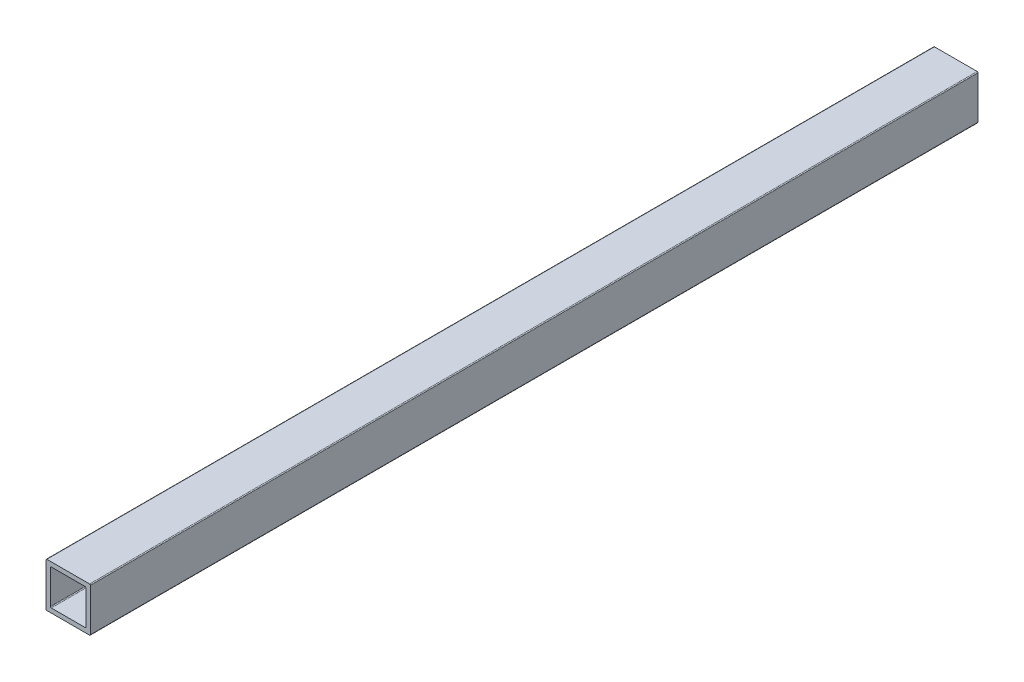
ISO-10303-21;
HEADER;
FILE_DESCRIPTION(('STEP AP214'),'2;1');
FILE_NAME('part.step','',(''),(''),'','','');
FILE_SCHEMA(('AUTOMOTIVE_DESIGN { 1 0 10303 214 1 1 1 1 }'));
ENDSEC;
DATA;
#1=APPLICATION_CONTEXT('core data for automotive mechanical design processes');
#2=APPLICATION_PROTOCOL_DEFINITION('international standard','automotive_design',2000,#1);
#3=PRODUCT_CONTEXT('',#1,'mechanical');
#4=PRODUCT('Part','Part','',(#3));
#5=PRODUCT_RELATED_PRODUCT_CATEGORY('part','',(#4));
#6=PRODUCT_DEFINITION_FORMATION('','',#4);
#7=PRODUCT_DEFINITION_CONTEXT('part definition',#1,'design');
#8=PRODUCT_DEFINITION('design','',#6,#7);
#9=PRODUCT_DEFINITION_SHAPE('','',#8);
#10=(LENGTH_UNIT() NAMED_UNIT(*) SI_UNIT(.MILLI.,.METRE.));
#11=(NAMED_UNIT(*) PLANE_ANGLE_UNIT() SI_UNIT($,.RADIAN.));
#12=(NAMED_UNIT(*) SI_UNIT($,.STERADIAN.) SOLID_ANGLE_UNIT());
#13=UNCERTAINTY_MEASURE_WITH_UNIT(LENGTH_MEASURE(1.E-05),#10,'distance_accuracy_value','');
#14=(GEOMETRIC_REPRESENTATION_CONTEXT(3) GLOBAL_UNCERTAINTY_ASSIGNED_CONTEXT((#13)) GLOBAL_UNIT_ASSIGNED_CONTEXT((#10,
#11,#12)) REPRESENTATION_CONTEXT('',''));
#15=CARTESIAN_POINT('',(0.,0.,0.));
#16=DIRECTION('',(0.,0.,1.));
#17=DIRECTION('',(1.,0.,0.));
#18=AXIS2_PLACEMENT_3D('',#15,#16,#17);
#19=CARTESIAN_POINT('',(0.,0.,200.));
#20=DIRECTION('',(0.,0.,1.));
#21=DIRECTION('',(1.,0.,0.));
#22=AXIS2_PLACEMENT_3D('',#19,#20,#21);
#23=PLANE('',#22);
#24=DIRECTION('',(0.,-1.,0.));
#25=VECTOR('',#24,1.);
#26=CARTESIAN_POINT('',(-5.,5.,200.));
#27=LINE('',#26,#25);
#28=CARTESIAN_POINT('',(-5.,4.8,200.));
#29=VERTEX_POINT('',#28);
#30=CARTESIAN_POINT('',(-5.,-4.8,200.));
#31=VERTEX_POINT('',#30);
#32=EDGE_CURVE('E265',#29,#31,#27,.T.);
#33=ORIENTED_EDGE('',*,*,#32,.T.);
#34=CARTESIAN_POINT('',(-4.8,-4.8,200.));
#35=DIRECTION('',(0.,0.,1.));
#36=DIRECTION('',(1.,0.,0.));
#37=AXIS2_PLACEMENT_3D('',#34,#35,#36);
#38=CIRCLE('',#37,0.2);
#39=CARTESIAN_POINT('',(-4.8,-5.,200.));
#40=VERTEX_POINT('',#39);
#41=EDGE_CURVE('E215',#31,#40,#38,.T.);
#42=ORIENTED_EDGE('',*,*,#41,.T.);
#43=DIRECTION('',(1.,0.,0.));
#44=VECTOR('',#43,1.);
#45=CARTESIAN_POINT('',(-5.,-5.,200.));
#46=LINE('',#45,#44);
#47=CARTESIAN_POINT('',(4.8,-5.,200.));
#48=VERTEX_POINT('',#47);
#49=EDGE_CURVE('E268',#40,#48,#46,.T.);
#50=ORIENTED_EDGE('',*,*,#49,.T.);
#51=CARTESIAN_POINT('',(4.8,-4.8,200.));
#52=DIRECTION('',(0.,0.,1.));
#53=DIRECTION('',(1.,0.,0.));
#54=AXIS2_PLACEMENT_3D('',#51,#52,#53);
#55=CIRCLE('',#54,0.2);
#56=CARTESIAN_POINT('',(5.,-4.8,200.));
#57=VERTEX_POINT('',#56);
#58=EDGE_CURVE('E213',#48,#57,#55,.T.);
#59=ORIENTED_EDGE('',*,*,#58,.T.);
#60=DIRECTION('',(0.,1.,0.));
#61=VECTOR('',#60,1.);
#62=CARTESIAN_POINT('',(5.,5.,200.));
#63=LINE('',#62,#61);
#64=CARTESIAN_POINT('',(5.,4.8,200.));
#65=VERTEX_POINT('',#64);
#66=EDGE_CURVE('E176',#57,#65,#63,.T.);
#67=ORIENTED_EDGE('',*,*,#66,.T.);
#68=CARTESIAN_POINT('',(4.8,4.8,200.));
#69=DIRECTION('',(0.,0.,1.));
#70=DIRECTION('',(1.,0.,0.));
#71=AXIS2_PLACEMENT_3D('',#68,#69,#70);
#72=CIRCLE('',#71,0.2);
#73=CARTESIAN_POINT('',(4.8,5.,200.));
#74=VERTEX_POINT('',#73);
#75=EDGE_CURVE('E209',#65,#74,#72,.T.);
#76=ORIENTED_EDGE('',*,*,#75,.T.);
#77=DIRECTION('',(-1.,0.,0.));
#78=VECTOR('',#77,1.);
#79=CARTESIAN_POINT('',(-5.,5.,200.));
#80=LINE('',#79,#78);
#81=CARTESIAN_POINT('',(-4.8,5.,200.));
#82=VERTEX_POINT('',#81);
#83=EDGE_CURVE('E171',#74,#82,#80,.T.);
#84=ORIENTED_EDGE('',*,*,#83,.T.);
#85=CARTESIAN_POINT('',(-4.8,4.8,200.));
#86=DIRECTION('',(0.,0.,1.));
#87=DIRECTION('',(1.,0.,0.));
#88=AXIS2_PLACEMENT_3D('',#85,#86,#87);
#89=CIRCLE('',#88,0.2);
#90=EDGE_CURVE('E211',#82,#29,#89,.T.);
#91=ORIENTED_EDGE('',*,*,#90,.T.);
#92=EDGE_LOOP('',(#33,#42,#50,#59,#67,#76,#84,#91));
#93=FACE_BOUND('',#92,.T.);
#94=DIRECTION('',(1.,0.,0.));
#95=VECTOR('',#94,1.);
#96=CARTESIAN_POINT('',(-4.,-4.,200.));
#97=LINE('',#96,#95);
#98=CARTESIAN_POINT('',(-3.8,-4.,200.));
#99=VERTEX_POINT('',#98);
#100=CARTESIAN_POINT('',(3.8,-4.,200.));
#101=VERTEX_POINT('',#100);
#102=EDGE_CURVE('E250',#99,#101,#97,.T.);
#103=ORIENTED_EDGE('',*,*,#102,.F.);
#104=CARTESIAN_POINT('',(-3.8,-3.8,200.));
#105=DIRECTION('',(0.,0.,1.));
#106=DIRECTION('',(1.,0.,0.));
#107=AXIS2_PLACEMENT_3D('',#104,#105,#106);
#108=CIRCLE('',#107,0.2);
#109=CARTESIAN_POINT('',(-4.,-3.8,200.));
#110=VERTEX_POINT('',#109);
#111=EDGE_CURVE('E11',#99,#110,#108,.F.);
#112=ORIENTED_EDGE('',*,*,#111,.T.);
#113=DIRECTION('',(0.,-1.,0.));
#114=VECTOR('',#113,1.);
#115=CARTESIAN_POINT('',(-4.,4.,200.));
#116=LINE('',#115,#114);
#117=CARTESIAN_POINT('',(-4.,3.8,200.));
#118=VERTEX_POINT('',#117);
#119=EDGE_CURVE('E248',#118,#110,#116,.T.);
#120=ORIENTED_EDGE('',*,*,#119,.F.);
#121=CARTESIAN_POINT('',(-3.8,3.8,200.));
#122=DIRECTION('',(0.,0.,1.));
#123=DIRECTION('',(1.,0.,0.));
#124=AXIS2_PLACEMENT_3D('',#121,#122,#123);
#125=CIRCLE('',#124,0.2);
#126=CARTESIAN_POINT('',(-3.8,4.,200.));
#127=VERTEX_POINT('',#126);
#128=EDGE_CURVE('E159',#118,#127,#125,.F.);
#129=ORIENTED_EDGE('',*,*,#128,.T.);
#130=DIRECTION('',(-1.,0.,0.));
#131=VECTOR('',#130,1.);
#132=CARTESIAN_POINT('',(-4.,4.,200.));
#133=LINE('',#132,#131);
#134=CARTESIAN_POINT('',(3.8,4.,200.));
#135=VERTEX_POINT('',#134);
#136=EDGE_CURVE('E260',#135,#127,#133,.T.);
#137=ORIENTED_EDGE('',*,*,#136,.F.);
#138=CARTESIAN_POINT('',(3.8,3.8,200.));
#139=DIRECTION('',(0.,0.,1.));
#140=DIRECTION('',(1.,0.,0.));
#141=AXIS2_PLACEMENT_3D('',#138,#139,#140);
#142=CIRCLE('',#141,0.2);
#143=CARTESIAN_POINT('',(4.,3.8,200.));
#144=VERTEX_POINT('',#143);
#145=EDGE_CURVE('E232',#135,#144,#142,.F.);
#146=ORIENTED_EDGE('',*,*,#145,.T.);
#147=DIRECTION('',(0.,1.,0.));
#148=VECTOR('',#147,1.);
#149=CARTESIAN_POINT('',(4.,4.,200.));
#150=LINE('',#149,#148);
#151=CARTESIAN_POINT('',(4.,-3.8,200.));
#152=VERTEX_POINT('',#151);
#153=EDGE_CURVE('E255',#152,#144,#150,.T.);
#154=ORIENTED_EDGE('',*,*,#153,.F.);
#155=CARTESIAN_POINT('',(3.8,-3.8,200.));
#156=DIRECTION('',(0.,0.,1.));
#157=DIRECTION('',(1.,0.,0.));
#158=AXIS2_PLACEMENT_3D('',#155,#156,#157);
#159=CIRCLE('',#158,0.2);
#160=EDGE_CURVE('E50',#152,#101,#159,.F.);
#161=ORIENTED_EDGE('',*,*,#160,.T.);
#162=EDGE_LOOP('',(#103,#112,#120,#129,#137,#146,#154,#161));
#163=FACE_BOUND('',#162,.T.);
#164=ADVANCED_FACE('F35',(#93,#163),#23,.T.);
#165=CARTESIAN_POINT('',(0.,0.,0.));
#166=DIRECTION('',(0.,0.,1.));
#167=DIRECTION('',(1.,0.,0.));
#168=AXIS2_PLACEMENT_3D('',#165,#166,#167);
#169=PLANE('',#168);
#170=DIRECTION('',(1.,0.,0.));
#171=VECTOR('',#170,1.);
#172=CARTESIAN_POINT('',(-5.,-5.,0.));
#173=LINE('',#172,#171);
#174=CARTESIAN_POINT('',(-4.8,-5.,0.));
#175=VERTEX_POINT('',#174);
#176=CARTESIAN_POINT('',(4.8,-5.,0.));
#177=VERTEX_POINT('',#176);
#178=EDGE_CURVE('E275',#175,#177,#173,.T.);
#179=ORIENTED_EDGE('',*,*,#178,.F.);
#180=CARTESIAN_POINT('',(-4.8,-4.8,0.));
#181=DIRECTION('',(0.,0.,1.));
#182=DIRECTION('',(1.,0.,0.));
#183=AXIS2_PLACEMENT_3D('',#180,#181,#182);
#184=CIRCLE('',#183,0.2);
#185=CARTESIAN_POINT('',(-5.,-4.8,0.));
#186=VERTEX_POINT('',#185);
#187=EDGE_CURVE('E202',#175,#186,#184,.F.);
#188=ORIENTED_EDGE('',*,*,#187,.T.);
#189=DIRECTION('',(0.,-1.,0.));
#190=VECTOR('',#189,1.);
#191=CARTESIAN_POINT('',(-5.,5.,0.));
#192=LINE('',#191,#190);
#193=CARTESIAN_POINT('',(-5.,4.8,0.));
#194=VERTEX_POINT('',#193);
#195=EDGE_CURVE('E263',#194,#186,#192,.T.);
#196=ORIENTED_EDGE('',*,*,#195,.F.);
#197=CARTESIAN_POINT('',(-4.8,4.8,0.));
#198=DIRECTION('',(0.,0.,1.));
#199=DIRECTION('',(1.,0.,0.));
#200=AXIS2_PLACEMENT_3D('',#197,#198,#199);
#201=CIRCLE('',#200,0.2);
#202=CARTESIAN_POINT('',(-4.8,5.,0.));
#203=VERTEX_POINT('',#202);
#204=EDGE_CURVE('E198',#194,#203,#201,.F.);
#205=ORIENTED_EDGE('',*,*,#204,.T.);
#206=DIRECTION('',(-1.,0.,0.));
#207=VECTOR('',#206,1.);
#208=CARTESIAN_POINT('',(-5.,5.,0.));
#209=LINE('',#208,#207);
#210=CARTESIAN_POINT('',(4.8,5.,0.));
#211=VERTEX_POINT('',#210);
#212=EDGE_CURVE('E179',#211,#203,#209,.T.);
#213=ORIENTED_EDGE('',*,*,#212,.F.);
#214=CARTESIAN_POINT('',(4.8,4.8,0.));
#215=DIRECTION('',(0.,0.,1.));
#216=DIRECTION('',(1.,0.,0.));
#217=AXIS2_PLACEMENT_3D('',#214,#215,#216);
#218=CIRCLE('',#217,0.2);
#219=CARTESIAN_POINT('',(5.,4.8,0.));
#220=VERTEX_POINT('',#219);
#221=EDGE_CURVE('E196',#211,#220,#218,.F.);
#222=ORIENTED_EDGE('',*,*,#221,.T.);
#223=DIRECTION('',(0.,1.,0.));
#224=VECTOR('',#223,1.);
#225=CARTESIAN_POINT('',(5.,5.,0.));
#226=LINE('',#225,#224);
#227=CARTESIAN_POINT('',(5.,-4.8,0.));
#228=VERTEX_POINT('',#227);
#229=EDGE_CURVE('E277',#228,#220,#226,.T.);
#230=ORIENTED_EDGE('',*,*,#229,.F.);
#231=CARTESIAN_POINT('',(4.8,-4.8,0.));
#232=DIRECTION('',(0.,0.,1.));
#233=DIRECTION('',(1.,0.,0.));
#234=AXIS2_PLACEMENT_3D('',#231,#232,#233);
#235=CIRCLE('',#234,0.2);
#236=EDGE_CURVE('E200',#228,#177,#235,.F.);
#237=ORIENTED_EDGE('',*,*,#236,.T.);
#238=EDGE_LOOP('',(#179,#188,#196,#205,#213,#222,#230,#237));
#239=FACE_BOUND('',#238,.T.);
#240=DIRECTION('',(-1.,0.,0.));
#241=VECTOR('',#240,1.);
#242=CARTESIAN_POINT('',(-4.,4.,0.));
#243=LINE('',#242,#241);
#244=CARTESIAN_POINT('',(3.8,4.,0.));
#245=VERTEX_POINT('',#244);
#246=CARTESIAN_POINT('',(-3.8,4.,0.));
#247=VERTEX_POINT('',#246);
#248=EDGE_CURVE('E168',#245,#247,#243,.T.);
#249=ORIENTED_EDGE('',*,*,#248,.T.);
#250=CARTESIAN_POINT('',(-3.8,3.8,0.));
#251=DIRECTION('',(0.,0.,1.));
#252=DIRECTION('',(1.,0.,0.));
#253=AXIS2_PLACEMENT_3D('',#250,#251,#252);
#254=CIRCLE('',#253,0.2);
#255=CARTESIAN_POINT('',(-4.,3.8,0.));
#256=VERTEX_POINT('',#255);
#257=EDGE_CURVE('E234',#247,#256,#254,.T.);
#258=ORIENTED_EDGE('',*,*,#257,.T.);
#259=DIRECTION('',(0.,-1.,0.));
#260=VECTOR('',#259,1.);
#261=CARTESIAN_POINT('',(-4.,4.,0.));
#262=LINE('',#261,#260);
#263=CARTESIAN_POINT('',(-4.,-3.8,0.));
#264=VERTEX_POINT('',#263);
#265=EDGE_CURVE('E239',#256,#264,#262,.T.);
#266=ORIENTED_EDGE('',*,*,#265,.T.);
#267=CARTESIAN_POINT('',(-3.8,-3.8,0.));
#268=DIRECTION('',(0.,0.,1.));
#269=DIRECTION('',(1.,0.,0.));
#270=AXIS2_PLACEMENT_3D('',#267,#268,#269);
#271=CIRCLE('',#270,0.2);
#272=CARTESIAN_POINT('',(-3.8,-4.,0.));
#273=VERTEX_POINT('',#272);
#274=EDGE_CURVE('E43',#264,#273,#271,.T.);
#275=ORIENTED_EDGE('',*,*,#274,.T.);
#276=DIRECTION('',(1.,0.,0.));
#277=VECTOR('',#276,1.);
#278=CARTESIAN_POINT('',(-4.,-4.,0.));
#279=LINE('',#278,#277);
#280=CARTESIAN_POINT('',(3.8,-4.,0.));
#281=VERTEX_POINT('',#280);
#282=EDGE_CURVE('E154',#273,#281,#279,.T.);
#283=ORIENTED_EDGE('',*,*,#282,.T.);
#284=CARTESIAN_POINT('',(3.8,-3.8,0.));
#285=DIRECTION('',(0.,0.,1.));
#286=DIRECTION('',(1.,0.,0.));
#287=AXIS2_PLACEMENT_3D('',#284,#285,#286);
#288=CIRCLE('',#287,0.2);
#289=CARTESIAN_POINT('',(4.,-3.8,0.));
#290=VERTEX_POINT('',#289);
#291=EDGE_CURVE('E149',#281,#290,#288,.T.);
#292=ORIENTED_EDGE('',*,*,#291,.T.);
#293=DIRECTION('',(0.,1.,0.));
#294=VECTOR('',#293,1.);
#295=CARTESIAN_POINT('',(4.,4.,0.));
#296=LINE('',#295,#294);
#297=CARTESIAN_POINT('',(4.,3.8,0.));
#298=VERTEX_POINT('',#297);
#299=EDGE_CURVE('E153',#290,#298,#296,.T.);
#300=ORIENTED_EDGE('',*,*,#299,.T.);
#301=CARTESIAN_POINT('',(3.8,3.8,0.));
#302=DIRECTION('',(0.,0.,1.));
#303=DIRECTION('',(1.,0.,0.));
#304=AXIS2_PLACEMENT_3D('',#301,#302,#303);
#305=CIRCLE('',#304,0.2);
#306=EDGE_CURVE('E230',#298,#245,#305,.T.);
#307=ORIENTED_EDGE('',*,*,#306,.T.);
#308=EDGE_LOOP('',(#249,#258,#266,#275,#283,#292,#300,#307));
#309=FACE_BOUND('',#308,.T.);
#310=ADVANCED_FACE('F152',(#239,#309),#169,.F.);
#311=CARTESIAN_POINT('',(-5.,5.,200.));
#312=DIRECTION('',(1.,0.,0.));
#313=DIRECTION('',(0.,1.,0.));
#314=AXIS2_PLACEMENT_3D('',#311,#312,#313);
#315=PLANE('',#314);
#316=ORIENTED_EDGE('',*,*,#195,.T.);
#317=DIRECTION('',(0.,0.,-1.));
#318=VECTOR('',#317,1.);
#319=CARTESIAN_POINT('',(-5.,-4.8,200.));
#320=LINE('',#319,#318);
#321=EDGE_CURVE('E207',#186,#31,#320,.F.);
#322=ORIENTED_EDGE('',*,*,#321,.T.);
#323=ORIENTED_EDGE('',*,*,#32,.F.);
#324=DIRECTION('',(0.,0.,-1.));
#325=VECTOR('',#324,1.);
#326=CARTESIAN_POINT('',(-5.,4.8,200.));
#327=LINE('',#326,#325);
#328=EDGE_CURVE('E204',#29,#194,#327,.T.);
#329=ORIENTED_EDGE('',*,*,#328,.T.);
#330=EDGE_LOOP('',(#316,#322,#323,#329));
#331=FACE_BOUND('',#330,.T.);
#332=ADVANCED_FACE('F298',(#331),#315,.F.);
#333=CARTESIAN_POINT('',(-5.,-5.,200.));
#334=DIRECTION('',(0.,1.,0.));
#335=DIRECTION('',(-1.,0.,0.));
#336=AXIS2_PLACEMENT_3D('',#333,#334,#335);
#337=PLANE('',#336);
#338=ORIENTED_EDGE('',*,*,#49,.F.);
#339=DIRECTION('',(0.,0.,-1.));
#340=VECTOR('',#339,1.);
#341=CARTESIAN_POINT('',(-4.8,-5.,200.));
#342=LINE('',#341,#340);
#343=EDGE_CURVE('E193',#40,#175,#342,.T.);
#344=ORIENTED_EDGE('',*,*,#343,.T.);
#345=ORIENTED_EDGE('',*,*,#178,.T.);
#346=DIRECTION('',(0.,0.,-1.));
#347=VECTOR('',#346,1.);
#348=CARTESIAN_POINT('',(4.8,-5.,200.));
#349=LINE('',#348,#347);
#350=EDGE_CURVE('E191',#177,#48,#349,.F.);
#351=ORIENTED_EDGE('',*,*,#350,.T.);
#352=EDGE_LOOP('',(#338,#344,#345,#351));
#353=FACE_BOUND('',#352,.T.);
#354=ADVANCED_FACE('F307',(#353),#337,.F.);
#355=CARTESIAN_POINT('',(5.,5.,200.));
#356=DIRECTION('',(-1.,0.,0.));
#357=DIRECTION('',(0.,-1.,0.));
#358=AXIS2_PLACEMENT_3D('',#355,#356,#357);
#359=PLANE('',#358);
#360=ORIENTED_EDGE('',*,*,#66,.F.);
#361=DIRECTION('',(0.,0.,-1.));
#362=VECTOR('',#361,1.);
#363=CARTESIAN_POINT('',(5.,-4.8,200.));
#364=LINE('',#363,#362);
#365=EDGE_CURVE('E222',#57,#228,#364,.T.);
#366=ORIENTED_EDGE('',*,*,#365,.T.);
#367=ORIENTED_EDGE('',*,*,#229,.T.);
#368=DIRECTION('',(0.,0.,-1.));
#369=VECTOR('',#368,1.);
#370=CARTESIAN_POINT('',(5.,4.8,200.));
#371=LINE('',#370,#369);
#372=EDGE_CURVE('E220',#220,#65,#371,.F.);
#373=ORIENTED_EDGE('',*,*,#372,.T.);
#374=EDGE_LOOP('',(#360,#366,#367,#373));
#375=FACE_BOUND('',#374,.T.);
#376=ADVANCED_FACE('F315',(#375),#359,.F.);
#377=CARTESIAN_POINT('',(-5.,5.,200.));
#378=DIRECTION('',(0.,-1.,0.));
#379=DIRECTION('',(1.,0.,0.));
#380=AXIS2_PLACEMENT_3D('',#377,#378,#379);
#381=PLANE('',#380);
#382=ORIENTED_EDGE('',*,*,#212,.T.);
#383=DIRECTION('',(0.,0.,-1.));
#384=VECTOR('',#383,1.);
#385=CARTESIAN_POINT('',(-4.8,5.,200.));
#386=LINE('',#385,#384);
#387=EDGE_CURVE('E228',#203,#82,#386,.F.);
#388=ORIENTED_EDGE('',*,*,#387,.T.);
#389=ORIENTED_EDGE('',*,*,#83,.F.);
#390=DIRECTION('',(0.,0.,-1.));
#391=VECTOR('',#390,1.);
#392=CARTESIAN_POINT('',(4.8,5.,200.));
#393=LINE('',#392,#391);
#394=EDGE_CURVE('E225',#74,#211,#393,.T.);
#395=ORIENTED_EDGE('',*,*,#394,.T.);
#396=EDGE_LOOP('',(#382,#388,#389,#395));
#397=FACE_BOUND('',#396,.T.);
#398=ADVANCED_FACE('F286',(#397),#381,.F.);
#399=CARTESIAN_POINT('',(-4.,4.,200.));
#400=DIRECTION('',(1.,0.,0.));
#401=DIRECTION('',(0.,1.,0.));
#402=AXIS2_PLACEMENT_3D('',#399,#400,#401);
#403=PLANE('',#402);
#404=ORIENTED_EDGE('',*,*,#265,.F.);
#405=DIRECTION('',(0.,0.,-1.));
#406=VECTOR('',#405,1.);
#407=CARTESIAN_POINT('',(-4.,3.8,200.));
#408=LINE('',#407,#406);
#409=EDGE_CURVE('E189',#256,#118,#408,.F.);
#410=ORIENTED_EDGE('',*,*,#409,.T.);
#411=ORIENTED_EDGE('',*,*,#119,.T.);
#412=DIRECTION('',(0.,0.,-1.));
#413=VECTOR('',#412,1.);
#414=CARTESIAN_POINT('',(-4.,-3.8,0.));
#415=LINE('',#414,#413);
#416=EDGE_CURVE('E186',#110,#264,#415,.T.);
#417=ORIENTED_EDGE('',*,*,#416,.T.);
#418=EDGE_LOOP('',(#404,#410,#411,#417));
#419=FACE_BOUND('',#418,.T.);
#420=ADVANCED_FACE('F252',(#419),#403,.T.);
#421=CARTESIAN_POINT('',(-4.,-4.,200.));
#422=DIRECTION('',(0.,1.,0.));
#423=DIRECTION('',(0.,0.,1.));
#424=AXIS2_PLACEMENT_3D('',#421,#422,#423);
#425=PLANE('',#424);
#426=ORIENTED_EDGE('',*,*,#102,.T.);
#427=DIRECTION('',(0.,0.,-1.));
#428=VECTOR('',#427,1.);
#429=CARTESIAN_POINT('',(3.8,-4.,0.));
#430=LINE('',#429,#428);
#431=EDGE_CURVE('E218',#101,#281,#430,.T.);
#432=ORIENTED_EDGE('',*,*,#431,.T.);
#433=ORIENTED_EDGE('',*,*,#282,.F.);
#434=DIRECTION('',(0.,0.,-1.));
#435=VECTOR('',#434,1.);
#436=CARTESIAN_POINT('',(-3.8,-4.,200.));
#437=LINE('',#436,#435);
#438=EDGE_CURVE('E57',#273,#99,#437,.F.);
#439=ORIENTED_EDGE('',*,*,#438,.T.);
#440=EDGE_LOOP('',(#426,#432,#433,#439));
#441=FACE_BOUND('',#440,.T.);
#442=ADVANCED_FACE('F242',(#441),#425,.T.);
#443=CARTESIAN_POINT('',(4.,4.,200.));
#444=DIRECTION('',(-1.,0.,0.));
#445=DIRECTION('',(0.,-1.,0.));
#446=AXIS2_PLACEMENT_3D('',#443,#444,#445);
#447=PLANE('',#446);
#448=ORIENTED_EDGE('',*,*,#153,.T.);
#449=DIRECTION('',(0.,0.,-1.));
#450=VECTOR('',#449,1.);
#451=CARTESIAN_POINT('',(4.,3.8,0.));
#452=LINE('',#451,#450);
#453=EDGE_CURVE('E167',#144,#298,#452,.T.);
#454=ORIENTED_EDGE('',*,*,#453,.T.);
#455=ORIENTED_EDGE('',*,*,#299,.F.);
#456=DIRECTION('',(0.,0.,-1.));
#457=VECTOR('',#456,1.);
#458=CARTESIAN_POINT('',(4.,-3.8,200.));
#459=LINE('',#458,#457);
#460=EDGE_CURVE('E165',#290,#152,#459,.F.);
#461=ORIENTED_EDGE('',*,*,#460,.T.);
#462=EDGE_LOOP('',(#448,#454,#455,#461));
#463=FACE_BOUND('',#462,.T.);
#464=ADVANCED_FACE('F164',(#463),#447,.T.);
#465=CARTESIAN_POINT('',(-4.,4.,200.));
#466=DIRECTION('',(0.,-1.,0.));
#467=DIRECTION('',(0.,0.,-1.));
#468=AXIS2_PLACEMENT_3D('',#465,#466,#467);
#469=PLANE('',#468);
#470=ORIENTED_EDGE('',*,*,#248,.F.);
#471=DIRECTION('',(0.,0.,-1.));
#472=VECTOR('',#471,1.);
#473=CARTESIAN_POINT('',(3.8,4.,200.));
#474=LINE('',#473,#472);
#475=EDGE_CURVE('E184',#245,#135,#474,.F.);
#476=ORIENTED_EDGE('',*,*,#475,.T.);
#477=ORIENTED_EDGE('',*,*,#136,.T.);
#478=DIRECTION('',(0.,0.,-1.));
#479=VECTOR('',#478,1.);
#480=CARTESIAN_POINT('',(-3.8,4.,0.));
#481=LINE('',#480,#479);
#482=EDGE_CURVE('E173',#127,#247,#481,.T.);
#483=ORIENTED_EDGE('',*,*,#482,.T.);
#484=EDGE_LOOP('',(#470,#476,#477,#483));
#485=FACE_BOUND('',#484,.T.);
#486=ADVANCED_FACE('F337',(#485),#469,.T.);
#487=CARTESIAN_POINT('',(3.8,3.8,200.));
#488=DIRECTION('',(0.,0.,1.));
#489=DIRECTION('',(1.,0.,0.));
#490=AXIS2_PLACEMENT_3D('',#487,#488,#489);
#491=CYLINDRICAL_SURFACE('',#490,0.2);
#492=ORIENTED_EDGE('',*,*,#145,.F.);
#493=ORIENTED_EDGE('',*,*,#475,.F.);
#494=ORIENTED_EDGE('',*,*,#306,.F.);
#495=ORIENTED_EDGE('',*,*,#453,.F.);
#496=EDGE_LOOP('',(#492,#493,#494,#495));
#497=FACE_BOUND('',#496,.T.);
#498=ADVANCED_FACE('F333',(#497),#491,.F.);
#499=CARTESIAN_POINT('',(-3.8,3.8,200.));
#500=DIRECTION('',(0.,0.,1.));
#501=DIRECTION('',(1.,0.,0.));
#502=AXIS2_PLACEMENT_3D('',#499,#500,#501);
#503=CYLINDRICAL_SURFACE('',#502,0.2);
#504=ORIENTED_EDGE('',*,*,#128,.F.);
#505=ORIENTED_EDGE('',*,*,#409,.F.);
#506=ORIENTED_EDGE('',*,*,#257,.F.);
#507=ORIENTED_EDGE('',*,*,#482,.F.);
#508=EDGE_LOOP('',(#504,#505,#506,#507));
#509=FACE_BOUND('',#508,.T.);
#510=ADVANCED_FACE('F336',(#509),#503,.F.);
#511=CARTESIAN_POINT('',(-4.8,-4.8,200.));
#512=DIRECTION('',(0.,0.,-1.));
#513=DIRECTION('',(-1.,0.,0.));
#514=AXIS2_PLACEMENT_3D('',#511,#512,#513);
#515=CYLINDRICAL_SURFACE('',#514,0.2);
#516=ORIENTED_EDGE('',*,*,#41,.F.);
#517=ORIENTED_EDGE('',*,*,#321,.F.);
#518=ORIENTED_EDGE('',*,*,#187,.F.);
#519=ORIENTED_EDGE('',*,*,#343,.F.);
#520=EDGE_LOOP('',(#516,#517,#518,#519));
#521=FACE_BOUND('',#520,.T.);
#522=ADVANCED_FACE('F302',(#521),#515,.T.);
#523=CARTESIAN_POINT('',(3.8,-3.8,200.));
#524=DIRECTION('',(0.,0.,1.));
#525=DIRECTION('',(1.,0.,0.));
#526=AXIS2_PLACEMENT_3D('',#523,#524,#525);
#527=CYLINDRICAL_SURFACE('',#526,0.2);
#528=ORIENTED_EDGE('',*,*,#160,.F.);
#529=ORIENTED_EDGE('',*,*,#460,.F.);
#530=ORIENTED_EDGE('',*,*,#291,.F.);
#531=ORIENTED_EDGE('',*,*,#431,.F.);
#532=EDGE_LOOP('',(#528,#529,#530,#531));
#533=FACE_BOUND('',#532,.T.);
#534=ADVANCED_FACE('F170',(#533),#527,.F.);
#535=CARTESIAN_POINT('',(4.8,-4.8,200.));
#536=DIRECTION('',(0.,0.,-1.));
#537=DIRECTION('',(-1.,0.,0.));
#538=AXIS2_PLACEMENT_3D('',#535,#536,#537);
#539=CYLINDRICAL_SURFACE('',#538,0.2);
#540=ORIENTED_EDGE('',*,*,#58,.F.);
#541=ORIENTED_EDGE('',*,*,#350,.F.);
#542=ORIENTED_EDGE('',*,*,#236,.F.);
#543=ORIENTED_EDGE('',*,*,#365,.F.);
#544=EDGE_LOOP('',(#540,#541,#542,#543));
#545=FACE_BOUND('',#544,.T.);
#546=ADVANCED_FACE('F311',(#545),#539,.T.);
#547=CARTESIAN_POINT('',(-4.8,4.8,200.));
#548=DIRECTION('',(0.,0.,-1.));
#549=DIRECTION('',(-1.,0.,0.));
#550=AXIS2_PLACEMENT_3D('',#547,#548,#549);
#551=CYLINDRICAL_SURFACE('',#550,0.2);
#552=ORIENTED_EDGE('',*,*,#90,.F.);
#553=ORIENTED_EDGE('',*,*,#387,.F.);
#554=ORIENTED_EDGE('',*,*,#204,.F.);
#555=ORIENTED_EDGE('',*,*,#328,.F.);
#556=EDGE_LOOP('',(#552,#553,#554,#555));
#557=FACE_BOUND('',#556,.T.);
#558=ADVANCED_FACE('F292',(#557),#551,.T.);
#559=CARTESIAN_POINT('',(-3.8,-3.8,200.));
#560=DIRECTION('',(0.,0.,1.));
#561=DIRECTION('',(1.,0.,0.));
#562=AXIS2_PLACEMENT_3D('',#559,#560,#561);
#563=CYLINDRICAL_SURFACE('',#562,0.2);
#564=ORIENTED_EDGE('',*,*,#111,.F.);
#565=ORIENTED_EDGE('',*,*,#438,.F.);
#566=ORIENTED_EDGE('',*,*,#274,.F.);
#567=ORIENTED_EDGE('',*,*,#416,.F.);
#568=EDGE_LOOP('',(#564,#565,#566,#567));
#569=FACE_BOUND('',#568,.T.);
#570=ADVANCED_FACE('F245',(#569),#563,.F.);
#571=CARTESIAN_POINT('',(4.8,4.8,200.));
#572=DIRECTION('',(0.,0.,-1.));
#573=DIRECTION('',(-1.,0.,0.));
#574=AXIS2_PLACEMENT_3D('',#571,#572,#573);
#575=CYLINDRICAL_SURFACE('',#574,0.2);
#576=ORIENTED_EDGE('',*,*,#75,.F.);
#577=ORIENTED_EDGE('',*,*,#372,.F.);
#578=ORIENTED_EDGE('',*,*,#221,.F.);
#579=ORIENTED_EDGE('',*,*,#394,.F.);
#580=EDGE_LOOP('',(#576,#577,#578,#579));
#581=FACE_BOUND('',#580,.T.);
#582=ADVANCED_FACE('F37',(#581),#575,.T.);
#583=CLOSED_SHELL('',(#164,#310,#332,#354,#376,#398,#420,#442,#464,#486,#498,#510,#522,#534,
#546,#558,#570,#582));
#584=MANIFOLD_SOLID_BREP('B2',#583);
#585=ADVANCED_BREP_SHAPE_REPRESENTATION('',(#18,#584),#14);
#586=SHAPE_DEFINITION_REPRESENTATION(#9,#585);
ENDSEC;
END-ISO-10303-21;
